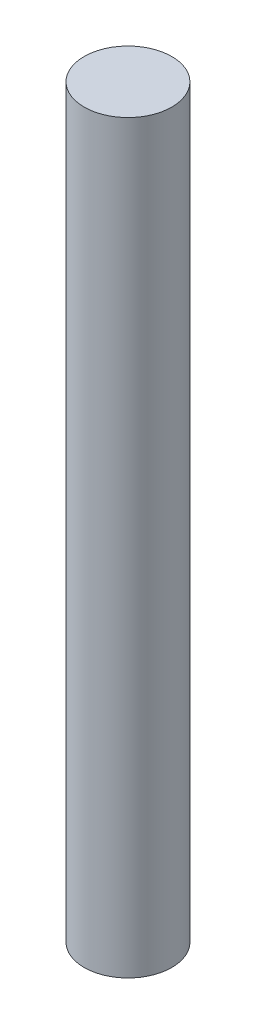
ISO-10303-21;
HEADER;
FILE_DESCRIPTION(('STEP AP214'),'2;1');
FILE_NAME('part.step','',(''),(''),'','','');
FILE_SCHEMA(('AUTOMOTIVE_DESIGN { 1 0 10303 214 1 1 1 1 }'));
ENDSEC;
DATA;
#1=APPLICATION_CONTEXT('core data for automotive mechanical design processes');
#2=APPLICATION_PROTOCOL_DEFINITION('international standard','automotive_design',2000,#1);
#3=PRODUCT_CONTEXT('',#1,'mechanical');
#4=PRODUCT('Part','Part','',(#3));
#5=PRODUCT_RELATED_PRODUCT_CATEGORY('part','',(#4));
#6=PRODUCT_DEFINITION_FORMATION('','',#4);
#7=PRODUCT_DEFINITION_CONTEXT('part definition',#1,'design');
#8=PRODUCT_DEFINITION('design','',#6,#7);
#9=PRODUCT_DEFINITION_SHAPE('','',#8);
#10=(LENGTH_UNIT() NAMED_UNIT(*) SI_UNIT(.MILLI.,.METRE.));
#11=(NAMED_UNIT(*) PLANE_ANGLE_UNIT() SI_UNIT($,.RADIAN.));
#12=(NAMED_UNIT(*) SI_UNIT($,.STERADIAN.) SOLID_ANGLE_UNIT());
#13=UNCERTAINTY_MEASURE_WITH_UNIT(LENGTH_MEASURE(1.E-05),#10,'distance_accuracy_value','');
#14=(GEOMETRIC_REPRESENTATION_CONTEXT(3) GLOBAL_UNCERTAINTY_ASSIGNED_CONTEXT((#13)) GLOBAL_UNIT_ASSIGNED_CONTEXT((#10,
#11,#12)) REPRESENTATION_CONTEXT('',''));
#15=CARTESIAN_POINT('',(0.,0.,0.));
#16=DIRECTION('',(0.,0.,1.));
#17=DIRECTION('',(1.,0.,0.));
#18=AXIS2_PLACEMENT_3D('',#15,#16,#17);
#19=CARTESIAN_POINT('',(0.,85.,0.));
#20=DIRECTION('',(0.,-1.,0.));
#21=DIRECTION('',(0.,0.,-1.));
#22=AXIS2_PLACEMENT_3D('',#19,#20,#21);
#23=CYLINDRICAL_SURFACE('',#22,5.);
#24=CARTESIAN_POINT('',(0.,85.,0.));
#25=DIRECTION('',(0.,1.,0.));
#26=DIRECTION('',(0.,0.,1.));
#27=AXIS2_PLACEMENT_3D('',#24,#25,#26);
#28=CIRCLE('',#27,5.);
#29=CARTESIAN_POINT('',(0.,85.,5.));
#30=VERTEX_POINT('',#29);
#31=EDGE_CURVE('E10',#30,#30,#28,.T.);
#32=ORIENTED_EDGE('',*,*,#31,.F.);
#33=EDGE_LOOP('',(#32));
#34=FACE_BOUND('',#33,.T.);
#35=CARTESIAN_POINT('',(0.,0.,0.));
#36=DIRECTION('',(0.,1.,0.));
#37=DIRECTION('',(0.,0.,1.));
#38=AXIS2_PLACEMENT_3D('',#35,#36,#37);
#39=CIRCLE('',#38,5.);
#40=CARTESIAN_POINT('',(0.,0.,5.));
#41=VERTEX_POINT('',#40);
#42=EDGE_CURVE('E37',#41,#41,#39,.T.);
#43=ORIENTED_EDGE('',*,*,#42,.T.);
#44=EDGE_LOOP('',(#43));
#45=FACE_BOUND('',#44,.T.);
#46=ADVANCED_FACE('F34',(#34,#45),#23,.T.);
#47=CARTESIAN_POINT('',(0.,85.,0.));
#48=DIRECTION('',(0.,1.,0.));
#49=DIRECTION('',(0.,0.,1.));
#50=AXIS2_PLACEMENT_3D('',#47,#48,#49);
#51=PLANE('',#50);
#52=ORIENTED_EDGE('',*,*,#31,.T.);
#53=EDGE_LOOP('',(#52));
#54=FACE_BOUND('',#53,.T.);
#55=ADVANCED_FACE('F49',(#54),#51,.T.);
#56=CARTESIAN_POINT('',(0.,0.,0.));
#57=DIRECTION('',(0.,1.,0.));
#58=DIRECTION('',(0.,0.,1.));
#59=AXIS2_PLACEMENT_3D('',#56,#57,#58);
#60=PLANE('',#59);
#61=ORIENTED_EDGE('',*,*,#42,.F.);
#62=EDGE_LOOP('',(#61));
#63=FACE_BOUND('',#62,.T.);
#64=ADVANCED_FACE('F47',(#63),#60,.F.);
#65=CLOSED_SHELL('',(#46,#55,#64));
#66=MANIFOLD_SOLID_BREP('B2',#65);
#67=ADVANCED_BREP_SHAPE_REPRESENTATION('',(#18,#66),#14);
#68=SHAPE_DEFINITION_REPRESENTATION(#9,#67);
ENDSEC;
END-ISO-10303-21;
